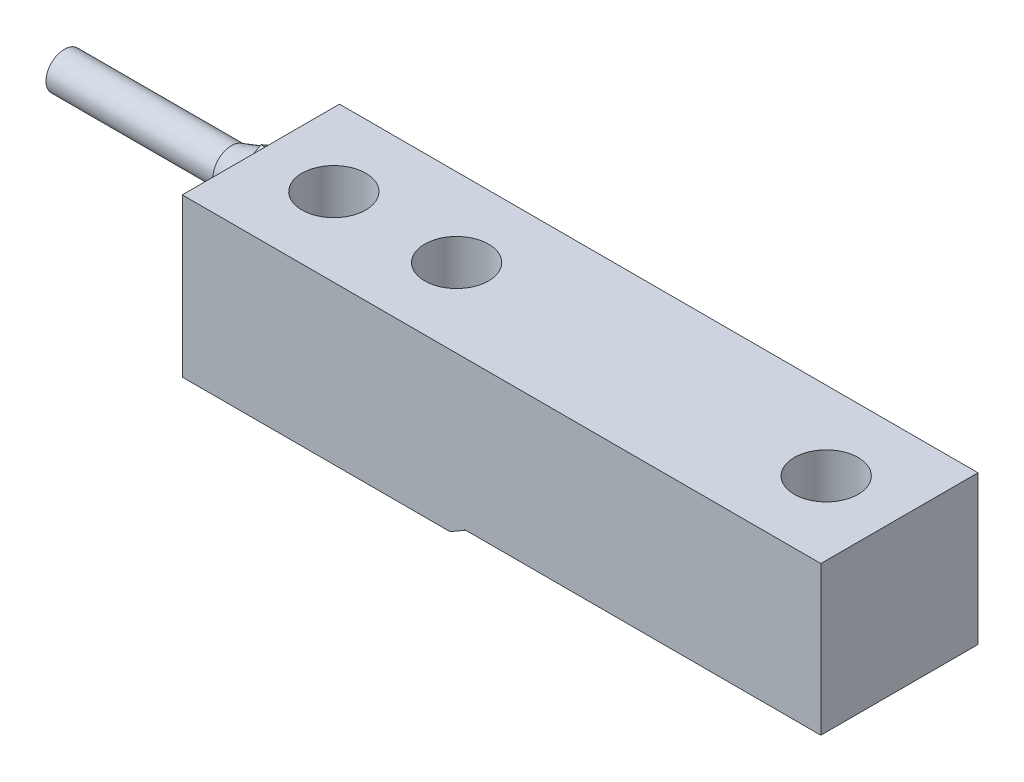
ISO-10303-21;
HEADER;
FILE_DESCRIPTION(('STEP AP214'),'2;1');
FILE_NAME('part.step','',(''),(''),'','','');
FILE_SCHEMA(('AUTOMOTIVE_DESIGN { 1 0 10303 214 1 1 1 1 }'));
ENDSEC;
DATA;
#1=APPLICATION_CONTEXT('core data for automotive mechanical design processes');
#2=APPLICATION_PROTOCOL_DEFINITION('international standard','automotive_design',2000,#1);
#3=PRODUCT_CONTEXT('',#1,'mechanical');
#4=PRODUCT('Part','Part','',(#3));
#5=PRODUCT_RELATED_PRODUCT_CATEGORY('part','',(#4));
#6=PRODUCT_DEFINITION_FORMATION('','',#4);
#7=PRODUCT_DEFINITION_CONTEXT('part definition',#1,'design');
#8=PRODUCT_DEFINITION('design','',#6,#7);
#9=PRODUCT_DEFINITION_SHAPE('','',#8);
#10=(LENGTH_UNIT() NAMED_UNIT(*) SI_UNIT(.MILLI.,.METRE.));
#11=(NAMED_UNIT(*) PLANE_ANGLE_UNIT() SI_UNIT($,.RADIAN.));
#12=(NAMED_UNIT(*) SI_UNIT($,.STERADIAN.) SOLID_ANGLE_UNIT());
#13=UNCERTAINTY_MEASURE_WITH_UNIT(LENGTH_MEASURE(1.E-05),#10,'distance_accuracy_value','');
#14=(GEOMETRIC_REPRESENTATION_CONTEXT(3) GLOBAL_UNCERTAINTY_ASSIGNED_CONTEXT((#13)) GLOBAL_UNIT_ASSIGNED_CONTEXT((#10,
#11,#12)) REPRESENTATION_CONTEXT('',''));
#15=CARTESIAN_POINT('',(0.,0.,0.));
#16=DIRECTION('',(0.,0.,1.));
#17=DIRECTION('',(1.,0.,0.));
#18=AXIS2_PLACEMENT_3D('',#15,#16,#17);
#19=CARTESIAN_POINT('',(0.,32.131,0.));
#20=DIRECTION('',(1.,0.,0.));
#21=DIRECTION('',(0.,0.,-1.));
#22=AXIS2_PLACEMENT_3D('',#19,#20,#21);
#23=PLANE('',#22);
#24=DIRECTION('',(0.,-1.,0.));
#25=VECTOR('',#24,1.);
#26=CARTESIAN_POINT('',(0.,32.131,-32.));
#27=LINE('',#26,#25);
#28=CARTESIAN_POINT('',(0.,32.131,-32.));
#29=VERTEX_POINT('',#28);
#30=CARTESIAN_POINT('',(0.,0.,-32.));
#31=VERTEX_POINT('',#30);
#32=EDGE_CURVE('E245',#29,#31,#27,.T.);
#33=ORIENTED_EDGE('',*,*,#32,.T.);
#34=DIRECTION('',(0.,0.,1.));
#35=VECTOR('',#34,1.);
#36=CARTESIAN_POINT('',(0.,0.,0.));
#37=LINE('',#36,#35);
#38=CARTESIAN_POINT('',(0.,0.,0.));
#39=VERTEX_POINT('',#38);
#40=EDGE_CURVE('E232',#31,#39,#37,.T.);
#41=ORIENTED_EDGE('',*,*,#40,.T.);
#42=DIRECTION('',(0.,-1.,0.));
#43=VECTOR('',#42,1.);
#44=CARTESIAN_POINT('',(0.,32.131,0.));
#45=LINE('',#44,#43);
#46=CARTESIAN_POINT('',(0.,32.131,0.));
#47=VERTEX_POINT('',#46);
#48=EDGE_CURVE('E260',#47,#39,#45,.T.);
#49=ORIENTED_EDGE('',*,*,#48,.F.);
#50=DIRECTION('',(0.,0.,1.));
#51=VECTOR('',#50,1.);
#52=CARTESIAN_POINT('',(0.,32.131,0.));
#53=LINE('',#52,#51);
#54=EDGE_CURVE('E235',#29,#47,#53,.T.);
#55=ORIENTED_EDGE('',*,*,#54,.F.);
#56=EDGE_LOOP('',(#33,#41,#49,#55));
#57=FACE_BOUND('',#56,.T.);
#58=CARTESIAN_POINT('',(0.,16.0655,-26.));
#59=DIRECTION('',(1.,0.,0.));
#60=DIRECTION('',(0.,1.,0.));
#61=AXIS2_PLACEMENT_3D('',#58,#59,#60);
#62=CIRCLE('',#61,5.92820323027551);
#63=CARTESIAN_POINT('',(0.,21.9937032302755,-26.));
#64=VERTEX_POINT('',#63);
#65=EDGE_CURVE('E180',#64,#64,#62,.T.);
#66=ORIENTED_EDGE('',*,*,#65,.T.);
#67=EDGE_LOOP('',(#66));
#68=FACE_BOUND('',#67,.T.);
#69=ADVANCED_FACE('F32',(#57,#68),#23,.F.);
#70=CARTESIAN_POINT('',(130.,32.131,0.));
#71=DIRECTION('',(-1.,0.,0.));
#72=DIRECTION('',(0.,0.,1.));
#73=AXIS2_PLACEMENT_3D('',#70,#71,#72);
#74=PLANE('',#73);
#75=DIRECTION('',(0.,0.,1.));
#76=VECTOR('',#75,1.);
#77=CARTESIAN_POINT('',(130.,1.85,0.));
#78=LINE('',#77,#76);
#79=CARTESIAN_POINT('',(130.,1.85,-32.));
#80=VERTEX_POINT('',#79);
#81=CARTESIAN_POINT('',(130.,1.85,0.));
#82=VERTEX_POINT('',#81);
#83=EDGE_CURVE('E199',#80,#82,#78,.T.);
#84=ORIENTED_EDGE('',*,*,#83,.F.);
#85=DIRECTION('',(0.,-1.,0.));
#86=VECTOR('',#85,1.);
#87=CARTESIAN_POINT('',(130.,32.131,-32.));
#88=LINE('',#87,#86);
#89=CARTESIAN_POINT('',(130.,32.131,-32.));
#90=VERTEX_POINT('',#89);
#91=EDGE_CURVE('E254',#90,#80,#88,.T.);
#92=ORIENTED_EDGE('',*,*,#91,.F.);
#93=DIRECTION('',(0.,0.,-1.));
#94=VECTOR('',#93,1.);
#95=CARTESIAN_POINT('',(130.,32.131,0.));
#96=LINE('',#95,#94);
#97=CARTESIAN_POINT('',(130.,32.131,0.));
#98=VERTEX_POINT('',#97);
#99=EDGE_CURVE('E241',#98,#90,#96,.T.);
#100=ORIENTED_EDGE('',*,*,#99,.F.);
#101=DIRECTION('',(0.,-1.,0.));
#102=VECTOR('',#101,1.);
#103=CARTESIAN_POINT('',(130.,32.131,0.));
#104=LINE('',#103,#102);
#105=EDGE_CURVE('E257',#98,#82,#104,.T.);
#106=ORIENTED_EDGE('',*,*,#105,.T.);
#107=EDGE_LOOP('',(#84,#92,#100,#106));
#108=FACE_BOUND('',#107,.T.);
#109=ADVANCED_FACE('F408',(#108),#74,.F.);
#110=CARTESIAN_POINT('',(115.1,20.131,-16.));
#111=DIRECTION('',(0.,1.,0.));
#112=DIRECTION('',(0.,0.,1.));
#113=AXIS2_PLACEMENT_3D('',#110,#111,#112);
#114=CYLINDRICAL_SURFACE('',#113,5.09999999999999);
#115=CARTESIAN_POINT('',(115.1,20.131,-16.));
#116=DIRECTION('',(0.,1.,0.));
#117=DIRECTION('',(0.,0.,1.));
#118=AXIS2_PLACEMENT_3D('',#115,#116,#117);
#119=CIRCLE('',#118,5.09999999999999);
#120=CARTESIAN_POINT('',(115.1,20.131,-10.9));
#121=VERTEX_POINT('',#120);
#122=EDGE_CURVE('E213',#121,#121,#119,.T.);
#123=ORIENTED_EDGE('',*,*,#122,.T.);
#124=EDGE_LOOP('',(#123));
#125=FACE_BOUND('',#124,.T.);
#126=CARTESIAN_POINT('',(115.1,1.85,-16.));
#127=DIRECTION('',(0.,-1.,0.));
#128=DIRECTION('',(0.,0.,-1.));
#129=AXIS2_PLACEMENT_3D('',#126,#127,#128);
#130=CIRCLE('',#129,5.09999999999999);
#131=CARTESIAN_POINT('',(115.1,1.85,-21.1));
#132=VERTEX_POINT('',#131);
#133=EDGE_CURVE('E210',#132,#132,#130,.F.);
#134=ORIENTED_EDGE('',*,*,#133,.F.);
#135=EDGE_LOOP('',(#134));
#136=FACE_BOUND('',#135,.T.);
#137=ADVANCED_FACE('F413',(#125,#136),#114,.F.);
#138=CARTESIAN_POINT('',(0.,32.131,0.));
#139=DIRECTION('',(0.,0.,-1.));
#140=DIRECTION('',(-1.,0.,0.));
#141=AXIS2_PLACEMENT_3D('',#138,#139,#140);
#142=PLANE('',#141);
#143=DIRECTION('',(1.,0.,0.));
#144=VECTOR('',#143,1.);
#145=CARTESIAN_POINT('',(0.,0.,0.));
#146=LINE('',#145,#144);
#147=CARTESIAN_POINT('',(54.5,0.,0.));
#148=VERTEX_POINT('',#147);
#149=EDGE_CURVE('E248',#39,#148,#146,.T.);
#150=ORIENTED_EDGE('',*,*,#149,.T.);
#151=DIRECTION('',(0.866025403784439,0.5,0.));
#152=VECTOR('',#151,1.);
#153=CARTESIAN_POINT('',(57.5,1.73205080756889,0.));
#154=LINE('',#153,#152);
#155=CARTESIAN_POINT('',(57.5,1.73205080756889,0.));
#156=VERTEX_POINT('',#155);
#157=EDGE_CURVE('E272',#148,#156,#154,.T.);
#158=ORIENTED_EDGE('',*,*,#157,.T.);
#159=DIRECTION('',(0.,-1.,0.));
#160=VECTOR('',#159,1.);
#161=CARTESIAN_POINT('',(57.5,1.85,0.));
#162=LINE('',#161,#160);
#163=CARTESIAN_POINT('',(57.5,1.85,0.));
#164=VERTEX_POINT('',#163);
#165=EDGE_CURVE('E206',#164,#156,#162,.T.);
#166=ORIENTED_EDGE('',*,*,#165,.F.);
#167=DIRECTION('',(-1.,0.,0.));
#168=VECTOR('',#167,1.);
#169=CARTESIAN_POINT('',(0.,1.85,0.));
#170=LINE('',#169,#168);
#171=EDGE_CURVE('E201',#82,#164,#170,.T.);
#172=ORIENTED_EDGE('',*,*,#171,.F.);
#173=ORIENTED_EDGE('',*,*,#105,.F.);
#174=DIRECTION('',(1.,0.,0.));
#175=VECTOR('',#174,1.);
#176=CARTESIAN_POINT('',(0.,32.131,0.));
#177=LINE('',#176,#175);
#178=EDGE_CURVE('E238',#47,#98,#177,.T.);
#179=ORIENTED_EDGE('',*,*,#178,.F.);
#180=ORIENTED_EDGE('',*,*,#48,.T.);
#181=EDGE_LOOP('',(#150,#158,#166,#172,#173,#179,#180));
#182=FACE_BOUND('',#181,.T.);
#183=ADVANCED_FACE('F418',(#182),#142,.F.);
#184=CARTESIAN_POINT('',(0.,32.131,-32.));
#185=DIRECTION('',(0.,0.,1.));
#186=DIRECTION('',(1.,0.,0.));
#187=AXIS2_PLACEMENT_3D('',#184,#185,#186);
#188=PLANE('',#187);
#189=DIRECTION('',(-1.,0.,0.));
#190=VECTOR('',#189,1.);
#191=CARTESIAN_POINT('',(0.,0.,-32.));
#192=LINE('',#191,#190);
#193=CARTESIAN_POINT('',(54.5,0.,-32.));
#194=VERTEX_POINT('',#193);
#195=EDGE_CURVE('E239',#194,#31,#192,.T.);
#196=ORIENTED_EDGE('',*,*,#195,.T.);
#197=ORIENTED_EDGE('',*,*,#32,.F.);
#198=DIRECTION('',(-1.,0.,0.));
#199=VECTOR('',#198,1.);
#200=CARTESIAN_POINT('',(0.,32.131,-32.));
#201=LINE('',#200,#199);
#202=EDGE_CURVE('E243',#90,#29,#201,.T.);
#203=ORIENTED_EDGE('',*,*,#202,.F.);
#204=ORIENTED_EDGE('',*,*,#91,.T.);
#205=DIRECTION('',(1.,0.,0.));
#206=VECTOR('',#205,1.);
#207=CARTESIAN_POINT('',(0.,1.85,-32.));
#208=LINE('',#207,#206);
#209=CARTESIAN_POINT('',(57.5,1.85,-32.));
#210=VERTEX_POINT('',#209);
#211=EDGE_CURVE('E197',#210,#80,#208,.T.);
#212=ORIENTED_EDGE('',*,*,#211,.F.);
#213=DIRECTION('',(0.,-1.,0.));
#214=VECTOR('',#213,1.);
#215=CARTESIAN_POINT('',(57.5,1.85,-32.));
#216=LINE('',#215,#214);
#217=CARTESIAN_POINT('',(57.5,1.73205080756889,-32.));
#218=VERTEX_POINT('',#217);
#219=EDGE_CURVE('E207',#210,#218,#216,.T.);
#220=ORIENTED_EDGE('',*,*,#219,.T.);
#221=DIRECTION('',(-0.866025403784439,-0.5,0.));
#222=VECTOR('',#221,1.);
#223=CARTESIAN_POINT('',(57.5,1.73205080756889,-32.));
#224=LINE('',#223,#222);
#225=EDGE_CURVE('E268',#218,#194,#224,.T.);
#226=ORIENTED_EDGE('',*,*,#225,.T.);
#227=EDGE_LOOP('',(#196,#197,#203,#204,#212,#220,#226));
#228=FACE_BOUND('',#227,.T.);
#229=ADVANCED_FACE('F402',(#228),#188,.F.);
#230=CARTESIAN_POINT('',(0.,32.131,0.));
#231=DIRECTION('',(0.,-1.,0.));
#232=DIRECTION('',(0.,0.,-1.));
#233=AXIS2_PLACEMENT_3D('',#230,#231,#232);
#234=PLANE('',#233);
#235=CARTESIAN_POINT('',(115.1,32.131,-16.));
#236=DIRECTION('',(0.,1.,0.));
#237=DIRECTION('',(0.,0.,1.));
#238=AXIS2_PLACEMENT_3D('',#235,#236,#237);
#239=CIRCLE('',#238,6.5);
#240=CARTESIAN_POINT('',(115.1,32.131,-9.49999999999999));
#241=VERTEX_POINT('',#240);
#242=EDGE_CURVE('E216',#241,#241,#239,.T.);
#243=ORIENTED_EDGE('',*,*,#242,.F.);
#244=EDGE_LOOP('',(#243));
#245=FACE_BOUND('',#244,.T.);
#246=CARTESIAN_POINT('',(39.85,32.131,-16.));
#247=DIRECTION('',(0.,1.,0.));
#248=DIRECTION('',(0.,0.,1.));
#249=AXIS2_PLACEMENT_3D('',#246,#247,#248);
#250=CIRCLE('',#249,6.5);
#251=CARTESIAN_POINT('',(39.85,32.131,-9.5));
#252=VERTEX_POINT('',#251);
#253=EDGE_CURVE('E220',#252,#252,#250,.T.);
#254=ORIENTED_EDGE('',*,*,#253,.F.);
#255=EDGE_LOOP('',(#254));
#256=FACE_BOUND('',#255,.T.);
#257=CARTESIAN_POINT('',(14.85,32.131,-16.));
#258=DIRECTION('',(0.,1.,0.));
#259=DIRECTION('',(0.,0.,1.));
#260=AXIS2_PLACEMENT_3D('',#257,#258,#259);
#261=CIRCLE('',#260,6.5);
#262=CARTESIAN_POINT('',(14.85,32.131,-9.5));
#263=VERTEX_POINT('',#262);
#264=EDGE_CURVE('E226',#263,#263,#261,.T.);
#265=ORIENTED_EDGE('',*,*,#264,.F.);
#266=EDGE_LOOP('',(#265));
#267=FACE_BOUND('',#266,.T.);
#268=ORIENTED_EDGE('',*,*,#54,.T.);
#269=ORIENTED_EDGE('',*,*,#178,.T.);
#270=ORIENTED_EDGE('',*,*,#99,.T.);
#271=ORIENTED_EDGE('',*,*,#202,.T.);
#272=EDGE_LOOP('',(#268,#269,#270,#271));
#273=FACE_BOUND('',#272,.T.);
#274=ADVANCED_FACE('F423',(#245,#256,#267,#273),#234,.F.);
#275=CARTESIAN_POINT('',(0.,0.,0.));
#276=DIRECTION('',(0.,-1.,0.));
#277=DIRECTION('',(0.,0.,-1.));
#278=AXIS2_PLACEMENT_3D('',#275,#276,#277);
#279=PLANE('',#278);
#280=ORIENTED_EDGE('',*,*,#195,.F.);
#281=DIRECTION('',(0.,0.,1.));
#282=VECTOR('',#281,1.);
#283=CARTESIAN_POINT('',(54.5,0.,0.));
#284=LINE('',#283,#282);
#285=EDGE_CURVE('E270',#194,#148,#284,.T.);
#286=ORIENTED_EDGE('',*,*,#285,.T.);
#287=ORIENTED_EDGE('',*,*,#149,.F.);
#288=ORIENTED_EDGE('',*,*,#40,.F.);
#289=EDGE_LOOP('',(#280,#286,#287,#288));
#290=FACE_BOUND('',#289,.T.);
#291=CARTESIAN_POINT('',(39.85,0.,-16.));
#292=DIRECTION('',(0.,1.,0.));
#293=DIRECTION('',(0.,0.,1.));
#294=AXIS2_PLACEMENT_3D('',#291,#292,#293);
#295=CIRCLE('',#294,6.5);
#296=CARTESIAN_POINT('',(39.85,0.,-9.5));
#297=VERTEX_POINT('',#296);
#298=EDGE_CURVE('E223',#297,#297,#295,.T.);
#299=ORIENTED_EDGE('',*,*,#298,.T.);
#300=EDGE_LOOP('',(#299));
#301=FACE_BOUND('',#300,.T.);
#302=CARTESIAN_POINT('',(14.85,0.,-16.));
#303=DIRECTION('',(0.,1.,0.));
#304=DIRECTION('',(0.,0.,1.));
#305=AXIS2_PLACEMENT_3D('',#302,#303,#304);
#306=CIRCLE('',#305,6.5);
#307=CARTESIAN_POINT('',(14.85,0.,-9.5));
#308=VERTEX_POINT('',#307);
#309=EDGE_CURVE('E229',#308,#308,#306,.T.);
#310=ORIENTED_EDGE('',*,*,#309,.T.);
#311=EDGE_LOOP('',(#310));
#312=FACE_BOUND('',#311,.T.);
#313=ADVANCED_FACE('F425',(#290,#301,#312),#279,.T.);
#314=CARTESIAN_POINT('',(14.85,0.,-16.));
#315=DIRECTION('',(0.,1.,0.));
#316=DIRECTION('',(0.,0.,1.));
#317=AXIS2_PLACEMENT_3D('',#314,#315,#316);
#318=CYLINDRICAL_SURFACE('',#317,6.5);
#319=ORIENTED_EDGE('',*,*,#309,.F.);
#320=EDGE_LOOP('',(#319));
#321=FACE_BOUND('',#320,.T.);
#322=ORIENTED_EDGE('',*,*,#264,.T.);
#323=EDGE_LOOP('',(#322));
#324=FACE_BOUND('',#323,.T.);
#325=ADVANCED_FACE('F428',(#321,#324),#318,.F.);
#326=CARTESIAN_POINT('',(39.85,0.,-16.));
#327=DIRECTION('',(0.,1.,0.));
#328=DIRECTION('',(0.,0.,1.));
#329=AXIS2_PLACEMENT_3D('',#326,#327,#328);
#330=CYLINDRICAL_SURFACE('',#329,6.5);
#331=ORIENTED_EDGE('',*,*,#298,.F.);
#332=EDGE_LOOP('',(#331));
#333=FACE_BOUND('',#332,.T.);
#334=ORIENTED_EDGE('',*,*,#253,.T.);
#335=EDGE_LOOP('',(#334));
#336=FACE_BOUND('',#335,.T.);
#337=ADVANCED_FACE('F435',(#333,#336),#330,.F.);
#338=CARTESIAN_POINT('',(115.1,20.131,-16.));
#339=DIRECTION('',(0.,1.,0.));
#340=DIRECTION('',(0.,0.,1.));
#341=AXIS2_PLACEMENT_3D('',#338,#339,#340);
#342=CYLINDRICAL_SURFACE('',#341,6.5);
#343=CARTESIAN_POINT('',(115.1,20.131,-16.));
#344=DIRECTION('',(0.,1.,0.));
#345=DIRECTION('',(0.,0.,1.));
#346=AXIS2_PLACEMENT_3D('',#343,#344,#345);
#347=CIRCLE('',#346,6.5);
#348=CARTESIAN_POINT('',(115.1,20.131,-9.49999999999999));
#349=VERTEX_POINT('',#348);
#350=EDGE_CURVE('E217',#349,#349,#347,.T.);
#351=ORIENTED_EDGE('',*,*,#350,.F.);
#352=EDGE_LOOP('',(#351));
#353=FACE_BOUND('',#352,.T.);
#354=ORIENTED_EDGE('',*,*,#242,.T.);
#355=EDGE_LOOP('',(#354));
#356=FACE_BOUND('',#355,.T.);
#357=ADVANCED_FACE('F439',(#353,#356),#342,.F.);
#358=CARTESIAN_POINT('',(115.1,20.131,-16.));
#359=DIRECTION('',(0.,1.,0.));
#360=DIRECTION('',(0.,0.,1.));
#361=AXIS2_PLACEMENT_3D('',#358,#359,#360);
#362=PLANE('',#361);
#363=ORIENTED_EDGE('',*,*,#122,.F.);
#364=EDGE_LOOP('',(#363));
#365=FACE_BOUND('',#364,.T.);
#366=ORIENTED_EDGE('',*,*,#350,.T.);
#367=EDGE_LOOP('',(#366));
#368=FACE_BOUND('',#367,.T.);
#369=ADVANCED_FACE('F443',(#365,#368),#362,.T.);
#370=CARTESIAN_POINT('',(0.,1.85,0.));
#371=DIRECTION('',(0.,-1.,0.));
#372=DIRECTION('',(0.,0.,-1.));
#373=AXIS2_PLACEMENT_3D('',#370,#371,#372);
#374=PLANE('',#373);
#375=ORIENTED_EDGE('',*,*,#211,.T.);
#376=ORIENTED_EDGE('',*,*,#83,.T.);
#377=ORIENTED_EDGE('',*,*,#171,.T.);
#378=DIRECTION('',(0.,0.,-1.));
#379=VECTOR('',#378,1.);
#380=CARTESIAN_POINT('',(57.5,1.85,0.));
#381=LINE('',#380,#379);
#382=EDGE_CURVE('E203',#164,#210,#381,.T.);
#383=ORIENTED_EDGE('',*,*,#382,.T.);
#384=EDGE_LOOP('',(#375,#376,#377,#383));
#385=FACE_BOUND('',#384,.T.);
#386=ORIENTED_EDGE('',*,*,#133,.T.);
#387=EDGE_LOOP('',(#386));
#388=FACE_BOUND('',#387,.T.);
#389=ADVANCED_FACE('F447',(#385,#388),#374,.T.);
#390=CARTESIAN_POINT('',(57.5,1.85,0.));
#391=DIRECTION('',(-1.,0.,0.));
#392=DIRECTION('',(0.,0.,1.));
#393=AXIS2_PLACEMENT_3D('',#390,#391,#392);
#394=PLANE('',#393);
#395=ORIENTED_EDGE('',*,*,#165,.T.);
#396=DIRECTION('',(0.,0.,-1.));
#397=VECTOR('',#396,1.);
#398=CARTESIAN_POINT('',(57.5,1.73205080756889,-32.));
#399=LINE('',#398,#397);
#400=EDGE_CURVE('E263',#156,#218,#399,.T.);
#401=ORIENTED_EDGE('',*,*,#400,.T.);
#402=ORIENTED_EDGE('',*,*,#219,.F.);
#403=ORIENTED_EDGE('',*,*,#382,.F.);
#404=EDGE_LOOP('',(#395,#401,#402,#403));
#405=FACE_BOUND('',#404,.T.);
#406=ADVANCED_FACE('F452',(#405),#394,.F.);
#407=CARTESIAN_POINT('',(57.5,1.73205080756889,0.));
#408=DIRECTION('',(0.5,-0.866025403784439,0.));
#409=DIRECTION('',(0.,0.,1.));
#410=AXIS2_PLACEMENT_3D('',#407,#408,#409);
#411=PLANE('',#410);
#412=ORIENTED_EDGE('',*,*,#157,.F.);
#413=ORIENTED_EDGE('',*,*,#285,.F.);
#414=ORIENTED_EDGE('',*,*,#225,.F.);
#415=ORIENTED_EDGE('',*,*,#400,.F.);
#416=EDGE_LOOP('',(#412,#413,#414,#415));
#417=FACE_BOUND('',#416,.T.);
#418=ADVANCED_FACE('F34',(#417),#411,.T.);
#419=CARTESIAN_POINT('',(-1.,22.9937032302755,-26.));
#420=DIRECTION('',(-1.,0.,0.));
#421=DIRECTION('',(0.,-1.,0.));
#422=AXIS2_PLACEMENT_3D('',#419,#420,#421);
#423=PLANE('',#422);
#424=CARTESIAN_POINT('',(-1.,16.0655,-26.));
#425=DIRECTION('',(1.,0.,0.));
#426=DIRECTION('',(0.,1.,0.));
#427=AXIS2_PLACEMENT_3D('',#424,#425,#426);
#428=CIRCLE('',#427,5.92820323027551);
#429=CARTESIAN_POINT('',(-1.,21.9937032302755,-26.));
#430=VERTEX_POINT('',#429);
#431=EDGE_CURVE('E325',#430,#430,#428,.T.);
#432=ORIENTED_EDGE('',*,*,#431,.F.);
#433=EDGE_LOOP('',(#432));
#434=FACE_BOUND('',#433,.T.);
#435=DIRECTION('',(0.,0.5,0.866025403784439));
#436=VECTOR('',#435,1.);
#437=CARTESIAN_POINT('',(-1.,9.13729676972449,-26.));
#438=LINE('',#437,#436);
#439=CARTESIAN_POINT('',(-0.999999999999999,9.13729676972449,-26.));
#440=VERTEX_POINT('',#439);
#441=CARTESIAN_POINT('',(-1.,12.6013983848622,-20.));
#442=VERTEX_POINT('',#441);
#443=EDGE_CURVE('E322',#440,#442,#438,.T.);
#444=ORIENTED_EDGE('',*,*,#443,.F.);
#445=DIRECTION('',(0.,-0.5,0.866025403784439));
#446=VECTOR('',#445,1.);
#447=CARTESIAN_POINT('',(-1.,12.6013983848622,-32.));
#448=LINE('',#447,#446);
#449=CARTESIAN_POINT('',(-1.,12.6013983848622,-32.));
#450=VERTEX_POINT('',#449);
#451=EDGE_CURVE('E274',#450,#440,#448,.T.);
#452=ORIENTED_EDGE('',*,*,#451,.F.);
#453=DIRECTION('',(0.,-1.,0.));
#454=VECTOR('',#453,1.);
#455=CARTESIAN_POINT('',(-0.999999999999997,32.131,-32.));
#456=LINE('',#455,#454);
#457=CARTESIAN_POINT('',(-1.,19.5296016151377,-32.));
#458=VERTEX_POINT('',#457);
#459=EDGE_CURVE('E320',#458,#450,#456,.T.);
#460=ORIENTED_EDGE('',*,*,#459,.F.);
#461=DIRECTION('',(0.,-0.5,-0.866025403784438));
#462=VECTOR('',#461,1.);
#463=CARTESIAN_POINT('',(-0.999999999999999,22.9937032302755,-26.));
#464=LINE('',#463,#462);
#465=CARTESIAN_POINT('',(-1.,22.9937032302755,-26.));
#466=VERTEX_POINT('',#465);
#467=EDGE_CURVE('E290',#466,#458,#464,.T.);
#468=ORIENTED_EDGE('',*,*,#467,.F.);
#469=DIRECTION('',(0.,0.5,-0.866025403784439));
#470=VECTOR('',#469,1.);
#471=CARTESIAN_POINT('',(-1.,19.5296016151378,-20.));
#472=LINE('',#471,#470);
#473=CARTESIAN_POINT('',(-1.,19.5296016151378,-20.));
#474=VERTEX_POINT('',#473);
#475=EDGE_CURVE('E316',#474,#466,#472,.T.);
#476=ORIENTED_EDGE('',*,*,#475,.F.);
#477=DIRECTION('',(0.,1.,0.));
#478=VECTOR('',#477,1.);
#479=CARTESIAN_POINT('',(-1.,12.6013983848622,-20.));
#480=LINE('',#479,#478);
#481=EDGE_CURVE('E313',#442,#474,#480,.T.);
#482=ORIENTED_EDGE('',*,*,#481,.F.);
#483=EDGE_LOOP('',(#444,#452,#460,#468,#476,#482));
#484=FACE_BOUND('',#483,.T.);
#485=ADVANCED_FACE('F472',(#434,#484),#423,.F.);
#486=CARTESIAN_POINT('',(0.,16.0655,-26.));
#487=DIRECTION('',(1.,0.,0.));
#488=DIRECTION('',(0.,1.,0.));
#489=AXIS2_PLACEMENT_3D('',#486,#487,#488);
#490=CYLINDRICAL_SURFACE('',#489,5.92820323027551);
#491=ORIENTED_EDGE('',*,*,#65,.F.);
#492=EDGE_LOOP('',(#491));
#493=FACE_BOUND('',#492,.T.);
#494=ORIENTED_EDGE('',*,*,#431,.T.);
#495=EDGE_LOOP('',(#494));
#496=FACE_BOUND('',#495,.T.);
#497=ADVANCED_FACE('F468',(#493,#496),#490,.T.);
#498=CARTESIAN_POINT('',(-10.,22.9937032302755,-26.));
#499=DIRECTION('',(0.,-0.866025403784438,0.5));
#500=DIRECTION('',(0.,-0.5,-0.866025403784438));
#501=AXIS2_PLACEMENT_3D('',#498,#499,#500);
#502=PLANE('',#501);
#503=DIRECTION('',(1.,0.,0.));
#504=VECTOR('',#503,1.);
#505=CARTESIAN_POINT('',(-10.,19.5296016151378,-32.));
#506=LINE('',#505,#504);
#507=CARTESIAN_POINT('',(-5.,19.5296016151378,-32.));
#508=VERTEX_POINT('',#507);
#509=EDGE_CURVE('E281',#508,#458,#506,.T.);
#510=ORIENTED_EDGE('',*,*,#509,.F.);
#511=DIRECTION('',(0.,0.5,0.866025403784438));
#512=VECTOR('',#511,1.);
#513=CARTESIAN_POINT('',(-5.,22.9937032302755,-26.));
#514=LINE('',#513,#512);
#515=CARTESIAN_POINT('',(-5.,22.9937032302755,-26.));
#516=VERTEX_POINT('',#515);
#517=EDGE_CURVE('E54',#508,#516,#514,.T.);
#518=ORIENTED_EDGE('',*,*,#517,.T.);
#519=DIRECTION('',(1.,0.,0.));
#520=VECTOR('',#519,1.);
#521=CARTESIAN_POINT('',(-10.,22.9937032302755,-26.));
#522=LINE('',#521,#520);
#523=EDGE_CURVE('E186',#516,#466,#522,.T.);
#524=ORIENTED_EDGE('',*,*,#523,.T.);
#525=ORIENTED_EDGE('',*,*,#467,.T.);
#526=EDGE_LOOP('',(#510,#518,#524,#525));
#527=FACE_BOUND('',#526,.T.);
#528=ADVANCED_FACE('F287',(#527),#502,.F.);
#529=CARTESIAN_POINT('',(-10.,19.5296016151378,-20.));
#530=DIRECTION('',(0.,-0.866025403784439,-0.5));
#531=DIRECTION('',(0.,0.5,-0.866025403784439));
#532=AXIS2_PLACEMENT_3D('',#529,#530,#531);
#533=PLANE('',#532);
#534=ORIENTED_EDGE('',*,*,#523,.F.);
#535=DIRECTION('',(0.,-0.5,0.866025403784439));
#536=VECTOR('',#535,1.);
#537=CARTESIAN_POINT('',(-5.,19.5296016151378,-20.));
#538=LINE('',#537,#536);
#539=CARTESIAN_POINT('',(-5.,19.5296016151378,-20.));
#540=VERTEX_POINT('',#539);
#541=EDGE_CURVE('E334',#516,#540,#538,.T.);
#542=ORIENTED_EDGE('',*,*,#541,.T.);
#543=DIRECTION('',(1.,0.,0.));
#544=VECTOR('',#543,1.);
#545=CARTESIAN_POINT('',(-10.,19.5296016151378,-20.));
#546=LINE('',#545,#544);
#547=EDGE_CURVE('E185',#540,#474,#546,.T.);
#548=ORIENTED_EDGE('',*,*,#547,.T.);
#549=ORIENTED_EDGE('',*,*,#475,.T.);
#550=EDGE_LOOP('',(#534,#542,#548,#549));
#551=FACE_BOUND('',#550,.T.);
#552=ADVANCED_FACE('F463',(#551),#533,.F.);
#553=CARTESIAN_POINT('',(-10.,12.6013983848623,-20.));
#554=DIRECTION('',(0.,0.,-1.));
#555=DIRECTION('',(-1.,0.,0.));
#556=AXIS2_PLACEMENT_3D('',#553,#554,#555);
#557=PLANE('',#556);
#558=ORIENTED_EDGE('',*,*,#547,.F.);
#559=DIRECTION('',(0.,-1.,0.));
#560=VECTOR('',#559,1.);
#561=CARTESIAN_POINT('',(-5.,12.6013983848622,-20.));
#562=LINE('',#561,#560);
#563=CARTESIAN_POINT('',(-5.,12.6013983848623,-20.));
#564=VERTEX_POINT('',#563);
#565=EDGE_CURVE('E337',#540,#564,#562,.T.);
#566=ORIENTED_EDGE('',*,*,#565,.T.);
#567=DIRECTION('',(1.,0.,0.));
#568=VECTOR('',#567,1.);
#569=CARTESIAN_POINT('',(-10.,12.6013983848623,-20.));
#570=LINE('',#569,#568);
#571=EDGE_CURVE('E193',#564,#442,#570,.T.);
#572=ORIENTED_EDGE('',*,*,#571,.T.);
#573=ORIENTED_EDGE('',*,*,#481,.T.);
#574=EDGE_LOOP('',(#558,#566,#572,#573));
#575=FACE_BOUND('',#574,.T.);
#576=ADVANCED_FACE('F400',(#575),#557,.F.);
#577=CARTESIAN_POINT('',(-10.,12.6013983848622,-32.));
#578=DIRECTION('',(0.,0.866025403784438,0.5));
#579=DIRECTION('',(0.,-0.5,0.866025403784439));
#580=AXIS2_PLACEMENT_3D('',#577,#578,#579);
#581=PLANE('',#580);
#582=DIRECTION('',(1.,0.,0.));
#583=VECTOR('',#582,1.);
#584=CARTESIAN_POINT('',(-10.,9.13729676972449,-26.));
#585=LINE('',#584,#583);
#586=CARTESIAN_POINT('',(-5.00000000000001,9.13729676972449,-26.));
#587=VERTEX_POINT('',#586);
#588=EDGE_CURVE('E300',#587,#440,#585,.T.);
#589=ORIENTED_EDGE('',*,*,#588,.F.);
#590=DIRECTION('',(0.,0.5,-0.866025403784439));
#591=VECTOR('',#590,1.);
#592=CARTESIAN_POINT('',(-5.,12.6013983848622,-32.));
#593=LINE('',#592,#591);
#594=CARTESIAN_POINT('',(-5.,12.6013983848622,-32.));
#595=VERTEX_POINT('',#594);
#596=EDGE_CURVE('E344',#587,#595,#593,.T.);
#597=ORIENTED_EDGE('',*,*,#596,.T.);
#598=DIRECTION('',(1.,0.,0.));
#599=VECTOR('',#598,1.);
#600=CARTESIAN_POINT('',(-10.,12.6013983848622,-32.));
#601=LINE('',#600,#599);
#602=EDGE_CURVE('E283',#595,#450,#601,.T.);
#603=ORIENTED_EDGE('',*,*,#602,.T.);
#604=ORIENTED_EDGE('',*,*,#451,.T.);
#605=EDGE_LOOP('',(#589,#597,#603,#604));
#606=FACE_BOUND('',#605,.T.);
#607=ADVANCED_FACE('F394',(#606),#581,.F.);
#608=CARTESIAN_POINT('',(-10.,9.13729676972449,-26.));
#609=DIRECTION('',(0.,0.866025403784439,-0.5));
#610=DIRECTION('',(0.,0.5,0.866025403784439));
#611=AXIS2_PLACEMENT_3D('',#608,#609,#610);
#612=PLANE('',#611);
#613=ORIENTED_EDGE('',*,*,#571,.F.);
#614=DIRECTION('',(0.,-0.5,-0.866025403784439));
#615=VECTOR('',#614,1.);
#616=CARTESIAN_POINT('',(-5.00000000000001,9.13729676972449,-26.));
#617=LINE('',#616,#615);
#618=EDGE_CURVE('E340',#564,#587,#617,.T.);
#619=ORIENTED_EDGE('',*,*,#618,.T.);
#620=ORIENTED_EDGE('',*,*,#588,.T.);
#621=ORIENTED_EDGE('',*,*,#443,.T.);
#622=EDGE_LOOP('',(#613,#619,#620,#621));
#623=FACE_BOUND('',#622,.T.);
#624=ADVANCED_FACE('F405',(#623),#612,.F.);
#625=ORIENTED_EDGE('',*,*,#602,.F.);
#626=DIRECTION('',(0.,1.,0.));
#627=VECTOR('',#626,1.);
#628=CARTESIAN_POINT('',(-5.,32.131,-32.));
#629=LINE('',#628,#627);
#630=EDGE_CURVE('E40',#595,#508,#629,.T.);
#631=ORIENTED_EDGE('',*,*,#630,.T.);
#632=ORIENTED_EDGE('',*,*,#509,.T.);
#633=ORIENTED_EDGE('',*,*,#459,.T.);
#634=EDGE_LOOP('',(#625,#631,#632,#633));
#635=FACE_BOUND('',#634,.T.);
#636=ADVANCED_FACE('F279',(#635),#188,.F.);
#637=CARTESIAN_POINT('',(-6.,22.9937032302755,-26.));
#638=DIRECTION('',(-1.,0.,0.));
#639=DIRECTION('',(0.,-1.,0.));
#640=AXIS2_PLACEMENT_3D('',#637,#638,#639);
#641=PLANE('',#640);
#642=CARTESIAN_POINT('',(-6.,16.0655,-26.));
#643=DIRECTION('',(1.,0.,0.));
#644=DIRECTION('',(0.,1.,0.));
#645=AXIS2_PLACEMENT_3D('',#642,#643,#644);
#646=CIRCLE('',#645,5.92820323027551);
#647=CARTESIAN_POINT('',(-6.,21.9937032302755,-26.));
#648=VERTEX_POINT('',#647);
#649=EDGE_CURVE('E346',#648,#648,#646,.T.);
#650=ORIENTED_EDGE('',*,*,#649,.F.);
#651=EDGE_LOOP('',(#650));
#652=FACE_BOUND('',#651,.T.);
#653=DIRECTION('',(0.,1.,0.));
#654=VECTOR('',#653,1.);
#655=CARTESIAN_POINT('',(-6.,12.6013983848622,-20.));
#656=LINE('',#655,#654);
#657=CARTESIAN_POINT('',(-6.,12.6013983848623,-20.));
#658=VERTEX_POINT('',#657);
#659=CARTESIAN_POINT('',(-6.,19.5296016151378,-20.));
#660=VERTEX_POINT('',#659);
#661=EDGE_CURVE('E181',#658,#660,#656,.T.);
#662=ORIENTED_EDGE('',*,*,#661,.F.);
#663=DIRECTION('',(0.,0.5,0.866025403784439));
#664=VECTOR('',#663,1.);
#665=CARTESIAN_POINT('',(-6.00000000000001,9.13729676972449,-26.));
#666=LINE('',#665,#664);
#667=CARTESIAN_POINT('',(-6.00000000000001,9.13729676972449,-26.));
#668=VERTEX_POINT('',#667);
#669=EDGE_CURVE('E169',#668,#658,#666,.T.);
#670=ORIENTED_EDGE('',*,*,#669,.F.);
#671=DIRECTION('',(0.,-0.5,0.866025403784439));
#672=VECTOR('',#671,1.);
#673=CARTESIAN_POINT('',(-6.,12.6013983848622,-32.));
#674=LINE('',#673,#672);
#675=CARTESIAN_POINT('',(-6.,12.6013983848622,-32.));
#676=VERTEX_POINT('',#675);
#677=EDGE_CURVE('E47',#676,#668,#674,.T.);
#678=ORIENTED_EDGE('',*,*,#677,.F.);
#679=DIRECTION('',(0.,-1.,0.));
#680=VECTOR('',#679,1.);
#681=CARTESIAN_POINT('',(-6.,32.131,-32.));
#682=LINE('',#681,#680);
#683=CARTESIAN_POINT('',(-6.,19.5296016151378,-32.));
#684=VERTEX_POINT('',#683);
#685=EDGE_CURVE('E11',#684,#676,#682,.T.);
#686=ORIENTED_EDGE('',*,*,#685,.F.);
#687=DIRECTION('',(0.,-0.5,-0.866025403784438));
#688=VECTOR('',#687,1.);
#689=CARTESIAN_POINT('',(-6.,22.9937032302755,-26.));
#690=LINE('',#689,#688);
#691=CARTESIAN_POINT('',(-6.,22.9937032302755,-26.));
#692=VERTEX_POINT('',#691);
#693=EDGE_CURVE('E160',#692,#684,#690,.T.);
#694=ORIENTED_EDGE('',*,*,#693,.F.);
#695=DIRECTION('',(0.,0.5,-0.866025403784439));
#696=VECTOR('',#695,1.);
#697=CARTESIAN_POINT('',(-6.,19.5296016151378,-20.));
#698=LINE('',#697,#696);
#699=EDGE_CURVE('E163',#660,#692,#698,.T.);
#700=ORIENTED_EDGE('',*,*,#699,.F.);
#701=EDGE_LOOP('',(#662,#670,#678,#686,#694,#700));
#702=FACE_BOUND('',#701,.T.);
#703=ADVANCED_FACE('F162',(#652,#702),#641,.F.);
#704=CARTESIAN_POINT('',(-5.,22.9937032302755,-26.));
#705=DIRECTION('',(1.,0.,0.));
#706=DIRECTION('',(0.,1.,0.));
#707=AXIS2_PLACEMENT_3D('',#704,#705,#706);
#708=PLANE('',#707);
#709=CARTESIAN_POINT('',(-5.,16.0655,-26.));
#710=DIRECTION('',(1.,0.,0.));
#711=DIRECTION('',(0.,1.,0.));
#712=AXIS2_PLACEMENT_3D('',#709,#710,#711);
#713=CIRCLE('',#712,5.92820323027551);
#714=CARTESIAN_POINT('',(-5.,21.9937032302755,-26.));
#715=VERTEX_POINT('',#714);
#716=EDGE_CURVE('E349',#715,#715,#713,.T.);
#717=ORIENTED_EDGE('',*,*,#716,.T.);
#718=EDGE_LOOP('',(#717));
#719=FACE_BOUND('',#718,.T.);
#720=ORIENTED_EDGE('',*,*,#517,.F.);
#721=ORIENTED_EDGE('',*,*,#630,.F.);
#722=ORIENTED_EDGE('',*,*,#596,.F.);
#723=ORIENTED_EDGE('',*,*,#618,.F.);
#724=ORIENTED_EDGE('',*,*,#565,.F.);
#725=ORIENTED_EDGE('',*,*,#541,.F.);
#726=EDGE_LOOP('',(#720,#721,#722,#723,#724,#725));
#727=FACE_BOUND('',#726,.T.);
#728=ADVANCED_FACE('F512',(#719,#727),#708,.F.);
#729=CARTESIAN_POINT('',(0.,16.0655,-26.));
#730=DIRECTION('',(1.,0.,0.));
#731=DIRECTION('',(0.,1.,0.));
#732=AXIS2_PLACEMENT_3D('',#729,#730,#731);
#733=CYLINDRICAL_SURFACE('',#732,5.92820323027551);
#734=ORIENTED_EDGE('',*,*,#716,.F.);
#735=EDGE_LOOP('',(#734));
#736=FACE_BOUND('',#735,.T.);
#737=ORIENTED_EDGE('',*,*,#649,.T.);
#738=EDGE_LOOP('',(#737));
#739=FACE_BOUND('',#738,.T.);
#740=ADVANCED_FACE('F380',(#736,#739),#733,.T.);
#741=CARTESIAN_POINT('',(-10.,0.,0.));
#742=DIRECTION('',(-1.,0.,0.));
#743=DIRECTION('',(0.,0.,1.));
#744=AXIS2_PLACEMENT_3D('',#741,#742,#743);
#745=PLANE('',#744);
#746=CARTESIAN_POINT('',(-10.,16.0655,-26.));
#747=DIRECTION('',(-1.,0.,0.));
#748=DIRECTION('',(0.,0.,1.));
#749=AXIS2_PLACEMENT_3D('',#746,#747,#748);
#750=CIRCLE('',#749,5.75);
#751=CARTESIAN_POINT('',(-10.,16.0655,-20.25));
#752=VERTEX_POINT('',#751);
#753=EDGE_CURVE('E352',#752,#752,#750,.T.);
#754=ORIENTED_EDGE('',*,*,#753,.F.);
#755=EDGE_LOOP('',(#754));
#756=FACE_BOUND('',#755,.T.);
#757=DIRECTION('',(0.,0.5,0.866025403784438));
#758=VECTOR('',#757,1.);
#759=CARTESIAN_POINT('',(-10.,9.13729676972449,-26.));
#760=LINE('',#759,#758);
#761=CARTESIAN_POINT('',(-10.,9.13729676972449,-26.));
#762=VERTEX_POINT('',#761);
#763=CARTESIAN_POINT('',(-10.,12.6013983848623,-20.));
#764=VERTEX_POINT('',#763);
#765=EDGE_CURVE('E310',#762,#764,#760,.T.);
#766=ORIENTED_EDGE('',*,*,#765,.T.);
#767=DIRECTION('',(0.,1.,0.));
#768=VECTOR('',#767,1.);
#769=CARTESIAN_POINT('',(-10.,12.6013983848623,-20.));
#770=LINE('',#769,#768);
#771=CARTESIAN_POINT('',(-10.,19.5296016151378,-20.));
#772=VERTEX_POINT('',#771);
#773=EDGE_CURVE('E308',#764,#772,#770,.T.);
#774=ORIENTED_EDGE('',*,*,#773,.T.);
#775=DIRECTION('',(0.,0.5,-0.866025403784439));
#776=VECTOR('',#775,1.);
#777=CARTESIAN_POINT('',(-10.,19.5296016151378,-20.));
#778=LINE('',#777,#776);
#779=CARTESIAN_POINT('',(-10.,22.9937032302755,-26.));
#780=VERTEX_POINT('',#779);
#781=EDGE_CURVE('E306',#772,#780,#778,.T.);
#782=ORIENTED_EDGE('',*,*,#781,.T.);
#783=DIRECTION('',(0.,-0.5,-0.866025403784438));
#784=VECTOR('',#783,1.);
#785=CARTESIAN_POINT('',(-10.,22.9937032302755,-26.));
#786=LINE('',#785,#784);
#787=CARTESIAN_POINT('',(-10.,19.5296016151378,-32.));
#788=VERTEX_POINT('',#787);
#789=EDGE_CURVE('E184',#780,#788,#786,.T.);
#790=ORIENTED_EDGE('',*,*,#789,.T.);
#791=DIRECTION('',(0.,-1.,0.));
#792=VECTOR('',#791,1.);
#793=CARTESIAN_POINT('',(-10.,19.5296016151378,-32.));
#794=LINE('',#793,#792);
#795=CARTESIAN_POINT('',(-10.,12.6013983848622,-32.));
#796=VERTEX_POINT('',#795);
#797=EDGE_CURVE('E303',#788,#796,#794,.T.);
#798=ORIENTED_EDGE('',*,*,#797,.T.);
#799=DIRECTION('',(0.,-0.5,0.866025403784438));
#800=VECTOR('',#799,1.);
#801=CARTESIAN_POINT('',(-10.,12.6013983848622,-32.));
#802=LINE('',#801,#800);
#803=EDGE_CURVE('E301',#796,#762,#802,.T.);
#804=ORIENTED_EDGE('',*,*,#803,.T.);
#805=EDGE_LOOP('',(#766,#774,#782,#790,#798,#804));
#806=FACE_BOUND('',#805,.T.);
#807=ADVANCED_FACE('F376',(#756,#806),#745,.T.);
#808=EDGE_CURVE('E296',#762,#668,#585,.T.);
#809=ORIENTED_EDGE('',*,*,#808,.T.);
#810=ORIENTED_EDGE('',*,*,#669,.T.);
#811=EDGE_CURVE('E194',#764,#658,#570,.T.);
#812=ORIENTED_EDGE('',*,*,#811,.F.);
#813=ORIENTED_EDGE('',*,*,#765,.F.);
#814=EDGE_LOOP('',(#809,#810,#812,#813));
#815=FACE_BOUND('',#814,.T.);
#816=ADVANCED_FACE('F379',(#815),#612,.F.);
#817=EDGE_CURVE('E189',#788,#684,#506,.T.);
#818=ORIENTED_EDGE('',*,*,#817,.T.);
#819=ORIENTED_EDGE('',*,*,#685,.T.);
#820=EDGE_CURVE('E291',#796,#676,#601,.T.);
#821=ORIENTED_EDGE('',*,*,#820,.F.);
#822=ORIENTED_EDGE('',*,*,#797,.F.);
#823=EDGE_LOOP('',(#818,#819,#821,#822));
#824=FACE_BOUND('',#823,.T.);
#825=ADVANCED_FACE('F390',(#824),#188,.F.);
#826=ORIENTED_EDGE('',*,*,#820,.T.);
#827=ORIENTED_EDGE('',*,*,#677,.T.);
#828=ORIENTED_EDGE('',*,*,#808,.F.);
#829=ORIENTED_EDGE('',*,*,#803,.F.);
#830=EDGE_LOOP('',(#826,#827,#828,#829));
#831=FACE_BOUND('',#830,.T.);
#832=ADVANCED_FACE('F391',(#831),#581,.F.);
#833=ORIENTED_EDGE('',*,*,#811,.T.);
#834=ORIENTED_EDGE('',*,*,#661,.T.);
#835=EDGE_CURVE('E179',#772,#660,#546,.T.);
#836=ORIENTED_EDGE('',*,*,#835,.F.);
#837=ORIENTED_EDGE('',*,*,#773,.F.);
#838=EDGE_LOOP('',(#833,#834,#836,#837));
#839=FACE_BOUND('',#838,.T.);
#840=ADVANCED_FACE('F387',(#839),#557,.F.);
#841=ORIENTED_EDGE('',*,*,#835,.T.);
#842=ORIENTED_EDGE('',*,*,#699,.T.);
#843=EDGE_CURVE('E176',#780,#692,#522,.T.);
#844=ORIENTED_EDGE('',*,*,#843,.F.);
#845=ORIENTED_EDGE('',*,*,#781,.F.);
#846=EDGE_LOOP('',(#841,#842,#844,#845));
#847=FACE_BOUND('',#846,.T.);
#848=ADVANCED_FACE('F174',(#847),#533,.F.);
#849=ORIENTED_EDGE('',*,*,#843,.T.);
#850=ORIENTED_EDGE('',*,*,#693,.T.);
#851=ORIENTED_EDGE('',*,*,#817,.F.);
#852=ORIENTED_EDGE('',*,*,#789,.F.);
#853=EDGE_LOOP('',(#849,#850,#851,#852));
#854=FACE_BOUND('',#853,.T.);
#855=ADVANCED_FACE('F183',(#854),#502,.F.);
#856=CARTESIAN_POINT('',(-10.,16.0655,-26.));
#857=DIRECTION('',(1.,0.,0.));
#858=DIRECTION('',(0.,0.,-1.));
#859=AXIS2_PLACEMENT_3D('',#856,#857,#858);
#860=CONICAL_SURFACE('',#859,5.75,0.321750554396642);
#861=CARTESIAN_POINT('',(-16.,16.0655,-26.));
#862=DIRECTION('',(-1.,0.,0.));
#863=DIRECTION('',(0.,0.,1.));
#864=AXIS2_PLACEMENT_3D('',#861,#862,#863);
#865=CIRCLE('',#864,3.75);
#866=CARTESIAN_POINT('',(-16.,16.0655,-22.25));
#867=VERTEX_POINT('',#866);
#868=EDGE_CURVE('E355',#867,#867,#865,.T.);
#869=ORIENTED_EDGE('',*,*,#868,.F.);
#870=EDGE_LOOP('',(#869));
#871=FACE_BOUND('',#870,.T.);
#872=ORIENTED_EDGE('',*,*,#753,.T.);
#873=EDGE_LOOP('',(#872));
#874=FACE_BOUND('',#873,.T.);
#875=ADVANCED_FACE('F367',(#871,#874),#860,.T.);
#876=CARTESIAN_POINT('',(-50.,16.0655,-26.));
#877=DIRECTION('',(-1.,0.,0.));
#878=DIRECTION('',(0.,0.,1.));
#879=AXIS2_PLACEMENT_3D('',#876,#877,#878);
#880=CYLINDRICAL_SURFACE('',#879,3.75);
#881=CARTESIAN_POINT('',(-50.,16.0655,-26.));
#882=DIRECTION('',(-1.,0.,0.));
#883=DIRECTION('',(0.,0.,1.));
#884=AXIS2_PLACEMENT_3D('',#881,#882,#883);
#885=CIRCLE('',#884,3.75);
#886=CARTESIAN_POINT('',(-50.,16.0655,-22.25));
#887=VERTEX_POINT('',#886);
#888=EDGE_CURVE('E358',#887,#887,#885,.T.);
#889=ORIENTED_EDGE('',*,*,#888,.F.);
#890=EDGE_LOOP('',(#889));
#891=FACE_BOUND('',#890,.T.);
#892=ORIENTED_EDGE('',*,*,#868,.T.);
#893=EDGE_LOOP('',(#892));
#894=FACE_BOUND('',#893,.T.);
#895=ADVANCED_FACE('F364',(#891,#894),#880,.T.);
#896=CARTESIAN_POINT('',(-50.,19.8155,-26.));
#897=DIRECTION('',(1.,0.,0.));
#898=DIRECTION('',(0.,0.,-1.));
#899=AXIS2_PLACEMENT_3D('',#896,#897,#898);
#900=PLANE('',#899);
#901=ORIENTED_EDGE('',*,*,#888,.T.);
#902=EDGE_LOOP('',(#901));
#903=FACE_BOUND('',#902,.T.);
#904=ADVANCED_FACE('F362',(#903),#900,.F.);
#905=CLOSED_SHELL('',(#69,#109,#137,#183,#229,#274,#313,#325,#337,#357,#369,#389,#406,#418,#485,
#497,#528,#552,#576,#607,#624,#636,#703,#728,#740,#807,#816,#825,#832,#840,#848,#855,#875,#895,#904));
#906=MANIFOLD_SOLID_BREP('B2',#905);
#907=ADVANCED_BREP_SHAPE_REPRESENTATION('',(#18,#906),#14);
#908=SHAPE_DEFINITION_REPRESENTATION(#9,#907);
ENDSEC;
END-ISO-10303-21;
